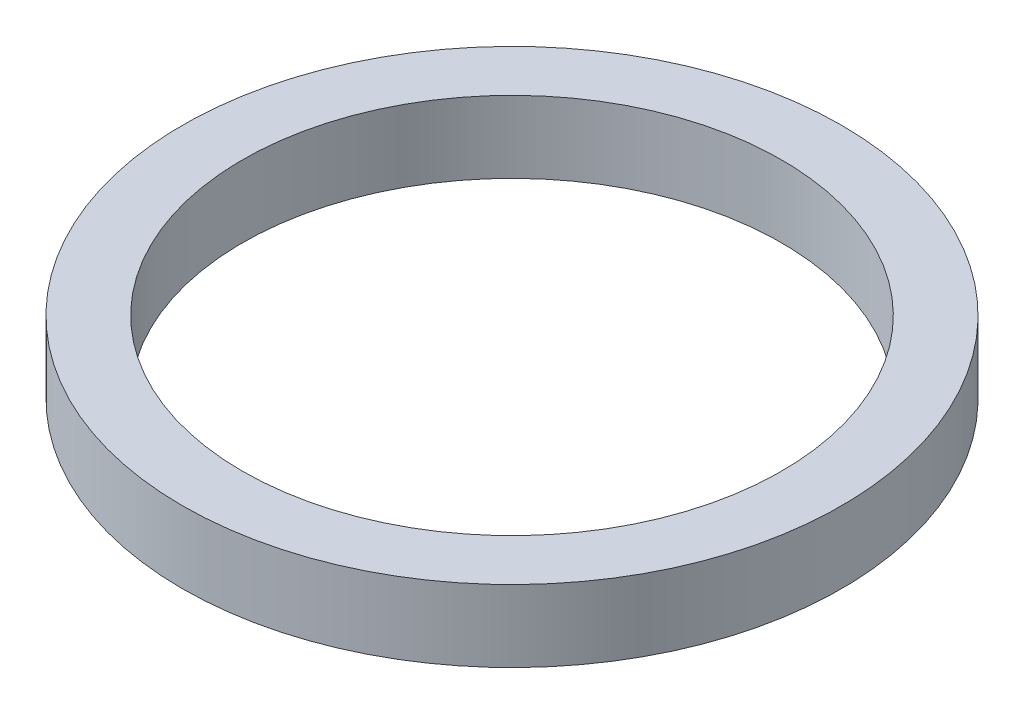
ISO-10303-21;
HEADER;
FILE_DESCRIPTION(('STEP AP214'),'2;1');
FILE_NAME('part.step','',(''),(''),'','','');
FILE_SCHEMA(('AUTOMOTIVE_DESIGN { 1 0 10303 214 1 1 1 1 }'));
ENDSEC;
DATA;
#1=APPLICATION_CONTEXT('core data for automotive mechanical design processes');
#2=APPLICATION_PROTOCOL_DEFINITION('international standard','automotive_design',2000,#1);
#3=PRODUCT_CONTEXT('',#1,'mechanical');
#4=PRODUCT('Part','Part','',(#3));
#5=PRODUCT_RELATED_PRODUCT_CATEGORY('part','',(#4));
#6=PRODUCT_DEFINITION_FORMATION('','',#4);
#7=PRODUCT_DEFINITION_CONTEXT('part definition',#1,'design');
#8=PRODUCT_DEFINITION('design','',#6,#7);
#9=PRODUCT_DEFINITION_SHAPE('','',#8);
#10=(LENGTH_UNIT() NAMED_UNIT(*) SI_UNIT(.MILLI.,.METRE.));
#11=(NAMED_UNIT(*) PLANE_ANGLE_UNIT() SI_UNIT($,.RADIAN.));
#12=(NAMED_UNIT(*) SI_UNIT($,.STERADIAN.) SOLID_ANGLE_UNIT());
#13=UNCERTAINTY_MEASURE_WITH_UNIT(LENGTH_MEASURE(1.E-05),#10,'distance_accuracy_value','');
#14=(GEOMETRIC_REPRESENTATION_CONTEXT(3) GLOBAL_UNCERTAINTY_ASSIGNED_CONTEXT((#13)) GLOBAL_UNIT_ASSIGNED_CONTEXT((#10,
#11,#12)) REPRESENTATION_CONTEXT('',''));
#15=CARTESIAN_POINT('',(0.,0.,0.));
#16=DIRECTION('',(0.,0.,1.));
#17=DIRECTION('',(1.,0.,0.));
#18=AXIS2_PLACEMENT_3D('',#15,#16,#17);
#19=CARTESIAN_POINT('',(0.,6.,0.));
#20=DIRECTION('',(0.,1.,0.));
#21=DIRECTION('',(0.,0.,1.));
#22=AXIS2_PLACEMENT_3D('',#19,#20,#21);
#23=PLANE('',#22);
#24=CARTESIAN_POINT('',(0.,6.,0.));
#25=DIRECTION('',(0.,1.,0.));
#26=DIRECTION('',(0.,0.,1.));
#27=AXIS2_PLACEMENT_3D('',#24,#25,#26);
#28=CIRCLE('',#27,27.5);
#29=CARTESIAN_POINT('',(0.,6.,27.5));
#30=VERTEX_POINT('',#29);
#31=EDGE_CURVE('E10',#30,#30,#28,.T.);
#32=ORIENTED_EDGE('',*,*,#31,.T.);
#33=EDGE_LOOP('',(#32));
#34=FACE_BOUND('',#33,.T.);
#35=CARTESIAN_POINT('',(0.,6.,0.));
#36=DIRECTION('',(0.,1.,0.));
#37=DIRECTION('',(0.,0.,1.));
#38=AXIS2_PLACEMENT_3D('',#35,#36,#37);
#39=CIRCLE('',#38,22.5);
#40=CARTESIAN_POINT('',(0.,6.,22.5));
#41=VERTEX_POINT('',#40);
#42=EDGE_CURVE('E50',#41,#41,#39,.T.);
#43=ORIENTED_EDGE('',*,*,#42,.F.);
#44=EDGE_LOOP('',(#43));
#45=FACE_BOUND('',#44,.T.);
#46=ADVANCED_FACE('F39',(#34,#45),#23,.T.);
#47=CARTESIAN_POINT('',(0.,0.,0.));
#48=DIRECTION('',(0.,1.,0.));
#49=DIRECTION('',(0.,0.,1.));
#50=AXIS2_PLACEMENT_3D('',#47,#48,#49);
#51=PLANE('',#50);
#52=CARTESIAN_POINT('',(0.,0.,0.));
#53=DIRECTION('',(0.,1.,0.));
#54=DIRECTION('',(0.,0.,1.));
#55=AXIS2_PLACEMENT_3D('',#52,#53,#54);
#56=CIRCLE('',#55,27.5);
#57=CARTESIAN_POINT('',(0.,0.,27.5));
#58=VERTEX_POINT('',#57);
#59=EDGE_CURVE('E43',#58,#58,#56,.T.);
#60=ORIENTED_EDGE('',*,*,#59,.F.);
#61=EDGE_LOOP('',(#60));
#62=FACE_BOUND('',#61,.T.);
#63=CARTESIAN_POINT('',(0.,0.,0.));
#64=DIRECTION('',(0.,1.,0.));
#65=DIRECTION('',(0.,0.,1.));
#66=AXIS2_PLACEMENT_3D('',#63,#64,#65);
#67=CIRCLE('',#66,22.5);
#68=CARTESIAN_POINT('',(0.,0.,22.5));
#69=VERTEX_POINT('',#68);
#70=EDGE_CURVE('E52',#69,#69,#67,.T.);
#71=ORIENTED_EDGE('',*,*,#70,.T.);
#72=EDGE_LOOP('',(#71));
#73=FACE_BOUND('',#72,.T.);
#74=ADVANCED_FACE('F62',(#62,#73),#51,.F.);
#75=CARTESIAN_POINT('',(0.,6.,0.));
#76=DIRECTION('',(0.,-1.,0.));
#77=DIRECTION('',(0.,0.,-1.));
#78=AXIS2_PLACEMENT_3D('',#75,#76,#77);
#79=CYLINDRICAL_SURFACE('',#78,27.5);
#80=ORIENTED_EDGE('',*,*,#31,.F.);
#81=EDGE_LOOP('',(#80));
#82=FACE_BOUND('',#81,.T.);
#83=ORIENTED_EDGE('',*,*,#59,.T.);
#84=EDGE_LOOP('',(#83));
#85=FACE_BOUND('',#84,.T.);
#86=ADVANCED_FACE('F41',(#82,#85),#79,.T.);
#87=CARTESIAN_POINT('',(0.,6.,0.));
#88=DIRECTION('',(0.,-1.,0.));
#89=DIRECTION('',(0.,0.,-1.));
#90=AXIS2_PLACEMENT_3D('',#87,#88,#89);
#91=CYLINDRICAL_SURFACE('',#90,22.5);
#92=ORIENTED_EDGE('',*,*,#42,.T.);
#93=EDGE_LOOP('',(#92));
#94=FACE_BOUND('',#93,.T.);
#95=ORIENTED_EDGE('',*,*,#70,.F.);
#96=EDGE_LOOP('',(#95));
#97=FACE_BOUND('',#96,.T.);
#98=ADVANCED_FACE('F58',(#94,#97),#91,.F.);
#99=CLOSED_SHELL('',(#46,#74,#86,#98));
#100=MANIFOLD_SOLID_BREP('B2',#99);
#101=ADVANCED_BREP_SHAPE_REPRESENTATION('',(#18,#100),#14);
#102=SHAPE_DEFINITION_REPRESENTATION(#9,#101);
ENDSEC;
END-ISO-10303-21;
